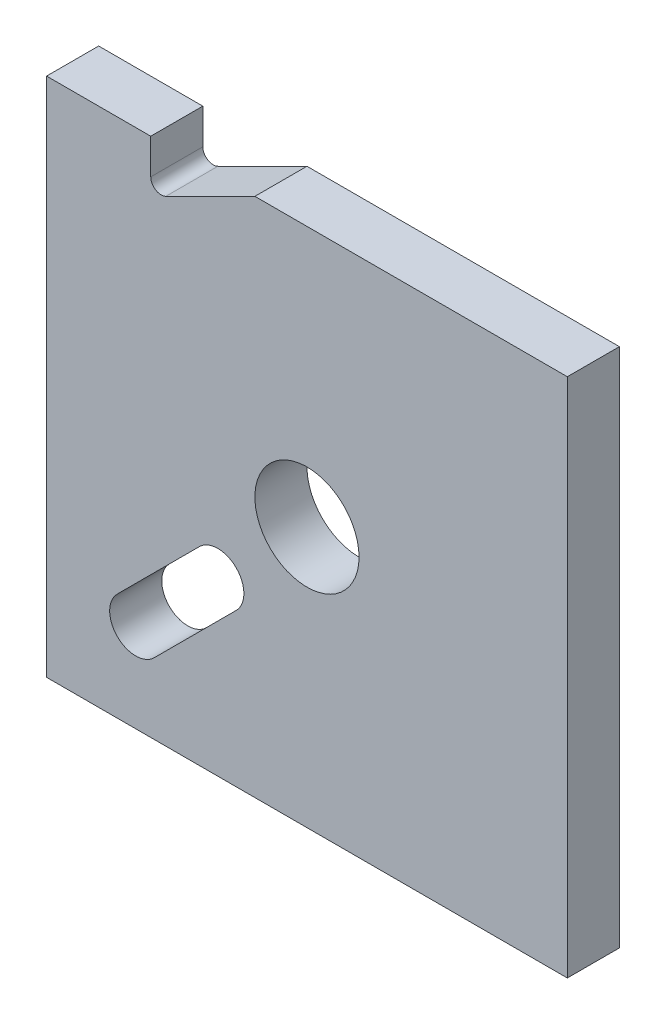
ISO-10303-21;
HEADER;
FILE_DESCRIPTION(('STEP AP214'),'2;1');
FILE_NAME('part.step','',(''),(''),'','','');
FILE_SCHEMA(('AUTOMOTIVE_DESIGN { 1 0 10303 214 1 1 1 1 }'));
ENDSEC;
DATA;
#1=APPLICATION_CONTEXT('core data for automotive mechanical design processes');
#2=APPLICATION_PROTOCOL_DEFINITION('international standard','automotive_design',2000,#1);
#3=PRODUCT_CONTEXT('',#1,'mechanical');
#4=PRODUCT('Part','Part','',(#3));
#5=PRODUCT_RELATED_PRODUCT_CATEGORY('part','',(#4));
#6=PRODUCT_DEFINITION_FORMATION('','',#4);
#7=PRODUCT_DEFINITION_CONTEXT('part definition',#1,'design');
#8=PRODUCT_DEFINITION('design','',#6,#7);
#9=PRODUCT_DEFINITION_SHAPE('','',#8);
#10=(LENGTH_UNIT() NAMED_UNIT(*) SI_UNIT(.MILLI.,.METRE.));
#11=(NAMED_UNIT(*) PLANE_ANGLE_UNIT() SI_UNIT($,.RADIAN.));
#12=(NAMED_UNIT(*) SI_UNIT($,.STERADIAN.) SOLID_ANGLE_UNIT());
#13=UNCERTAINTY_MEASURE_WITH_UNIT(LENGTH_MEASURE(1.E-05),#10,'distance_accuracy_value','');
#14=(GEOMETRIC_REPRESENTATION_CONTEXT(3) GLOBAL_UNCERTAINTY_ASSIGNED_CONTEXT((#13)) GLOBAL_UNIT_ASSIGNED_CONTEXT((#10,
#11,#12)) REPRESENTATION_CONTEXT('',''));
#15=CARTESIAN_POINT('',(0.,0.,0.));
#16=DIRECTION('',(0.,0.,1.));
#17=DIRECTION('',(1.,0.,0.));
#18=AXIS2_PLACEMENT_3D('',#15,#16,#17);
#19=CARTESIAN_POINT('',(0.,0.,2.5));
#20=DIRECTION('',(0.,0.,1.));
#21=DIRECTION('',(1.,0.,0.));
#22=AXIS2_PLACEMENT_3D('',#19,#20,#21);
#23=PLANE('',#22);
#24=CARTESIAN_POINT('',(-8.55806902390052,-8.55806902390052,2.5));
#25=DIRECTION('',(0.,0.,1.));
#26=DIRECTION('',(1.,0.,0.));
#27=AXIS2_PLACEMENT_3D('',#24,#25,#26);
#28=CIRCLE('',#27,2.5);
#29=CARTESIAN_POINT('',(-6.79030207093415,-10.3258359768669,2.5));
#30=VERTEX_POINT('',#29);
#31=CARTESIAN_POINT('',(-10.3258359768669,-6.79030207093415,2.5));
#32=VERTEX_POINT('',#31);
#33=EDGE_CURVE('E57',#30,#32,#28,.T.);
#34=ORIENTED_EDGE('',*,*,#33,.F.);
#35=DIRECTION('',(0.707106781186547,0.707106781186548,0.));
#36=VECTOR('',#35,1.);
#37=CARTESIAN_POINT('',(-6.79030207093415,-10.3258359768669,2.5));
#38=LINE('',#37,#36);
#39=CARTESIAN_POINT('',(-14.6741640231331,-18.2096979290659,2.5));
#40=VERTEX_POINT('',#39);
#41=EDGE_CURVE('E175',#40,#30,#38,.T.);
#42=ORIENTED_EDGE('',*,*,#41,.F.);
#43=CARTESIAN_POINT('',(-16.4419309760995,-16.4419309760995,2.5));
#44=DIRECTION('',(0.,0.,1.));
#45=DIRECTION('',(1.,0.,0.));
#46=AXIS2_PLACEMENT_3D('',#43,#44,#45);
#47=CIRCLE('',#46,2.5);
#48=CARTESIAN_POINT('',(-18.2096979290659,-14.6741640231331,2.5));
#49=VERTEX_POINT('',#48);
#50=EDGE_CURVE('E183',#49,#40,#47,.T.);
#51=ORIENTED_EDGE('',*,*,#50,.F.);
#52=DIRECTION('',(-0.707106781186547,-0.707106781186548,0.));
#53=VECTOR('',#52,1.);
#54=CARTESIAN_POINT('',(-10.3258359768669,-6.79030207093415,2.5));
#55=LINE('',#54,#53);
#56=EDGE_CURVE('E190',#32,#49,#55,.T.);
#57=ORIENTED_EDGE('',*,*,#56,.F.);
#58=EDGE_LOOP('',(#34,#42,#51,#57));
#59=FACE_BOUND('',#58,.T.);
#60=CARTESIAN_POINT('',(0.,0.,2.5));
#61=DIRECTION('',(0.,0.,1.));
#62=DIRECTION('',(1.,0.,0.));
#63=AXIS2_PLACEMENT_3D('',#60,#61,#62);
#64=CIRCLE('',#63,5.);
#65=CARTESIAN_POINT('',(4.99999999999999,0.,2.5));
#66=VERTEX_POINT('',#65);
#67=EDGE_CURVE('E218',#66,#66,#64,.T.);
#68=ORIENTED_EDGE('',*,*,#67,.F.);
#69=EDGE_LOOP('',(#68));
#70=FACE_BOUND('',#69,.T.);
#71=DIRECTION('',(-0.894427190999916,-0.447213595499958,0.));
#72=VECTOR('',#71,1.);
#73=CARTESIAN_POINT('',(-11.,22.,2.5));
#74=LINE('',#73,#72);
#75=CARTESIAN_POINT('',(-5.,25.,2.5));
#76=VERTEX_POINT('',#75);
#77=CARTESIAN_POINT('',(-13.5527864045,20.72360679775,2.5));
#78=VERTEX_POINT('',#77);
#79=EDGE_CURVE('E133',#76,#78,#74,.T.);
#80=ORIENTED_EDGE('',*,*,#79,.T.);
#81=CARTESIAN_POINT('',(-14.,21.6180339887499,2.5));
#82=DIRECTION('',(0.,0.,1.));
#83=DIRECTION('',(1.,0.,0.));
#84=AXIS2_PLACEMENT_3D('',#81,#82,#83);
#85=CIRCLE('',#84,1.);
#86=CARTESIAN_POINT('',(-15.,21.6180339887499,2.5));
#87=VERTEX_POINT('',#86);
#88=EDGE_CURVE('E142',#78,#87,#85,.F.);
#89=ORIENTED_EDGE('',*,*,#88,.T.);
#90=DIRECTION('',(0.,1.,0.));
#91=VECTOR('',#90,1.);
#92=CARTESIAN_POINT('',(-15.,0.,2.5));
#93=LINE('',#92,#91);
#94=CARTESIAN_POINT('',(-15.,25.,2.5));
#95=VERTEX_POINT('',#94);
#96=EDGE_CURVE('E147',#87,#95,#93,.T.);
#97=ORIENTED_EDGE('',*,*,#96,.T.);
#98=DIRECTION('',(-1.,0.,0.));
#99=VECTOR('',#98,1.);
#100=CARTESIAN_POINT('',(-25.,25.,2.5));
#101=LINE('',#100,#99);
#102=CARTESIAN_POINT('',(-25.,25.,2.5));
#103=VERTEX_POINT('',#102);
#104=EDGE_CURVE('E229',#95,#103,#101,.T.);
#105=ORIENTED_EDGE('',*,*,#104,.T.);
#106=DIRECTION('',(0.,-1.,0.));
#107=VECTOR('',#106,1.);
#108=CARTESIAN_POINT('',(-25.,25.,2.5));
#109=LINE('',#108,#107);
#110=CARTESIAN_POINT('',(-25.,-25.,2.5));
#111=VERTEX_POINT('',#110);
#112=EDGE_CURVE('E233',#103,#111,#109,.T.);
#113=ORIENTED_EDGE('',*,*,#112,.T.);
#114=DIRECTION('',(1.,0.,0.));
#115=VECTOR('',#114,1.);
#116=CARTESIAN_POINT('',(-25.,-25.,2.5));
#117=LINE('',#116,#115);
#118=CARTESIAN_POINT('',(25.,-25.,2.5));
#119=VERTEX_POINT('',#118);
#120=EDGE_CURVE('E258',#111,#119,#117,.T.);
#121=ORIENTED_EDGE('',*,*,#120,.T.);
#122=DIRECTION('',(0.,1.,0.));
#123=VECTOR('',#122,1.);
#124=CARTESIAN_POINT('',(25.,25.,2.5));
#125=LINE('',#124,#123);
#126=CARTESIAN_POINT('',(25.,25.,2.5));
#127=VERTEX_POINT('',#126);
#128=EDGE_CURVE('E226',#119,#127,#125,.T.);
#129=ORIENTED_EDGE('',*,*,#128,.T.);
#130=EDGE_CURVE('E145',#127,#76,#101,.T.);
#131=ORIENTED_EDGE('',*,*,#130,.T.);
#132=EDGE_LOOP('',(#80,#89,#97,#105,#113,#121,#129,#131));
#133=FACE_BOUND('',#132,.T.);
#134=ADVANCED_FACE('F39',(#59,#70,#133),#23,.T.);
#135=CARTESIAN_POINT('',(0.,0.,-2.5));
#136=DIRECTION('',(0.,0.,1.));
#137=DIRECTION('',(1.,0.,0.));
#138=AXIS2_PLACEMENT_3D('',#135,#136,#137);
#139=PLANE('',#138);
#140=DIRECTION('',(0.707106781186547,0.707106781186548,0.));
#141=VECTOR('',#140,1.);
#142=CARTESIAN_POINT('',(-14.6741640231331,-18.2096979290659,-2.5));
#143=LINE('',#142,#141);
#144=CARTESIAN_POINT('',(-14.6741640231331,-18.2096979290659,-2.5));
#145=VERTEX_POINT('',#144);
#146=CARTESIAN_POINT('',(-6.79030207093415,-10.3258359768669,-2.5));
#147=VERTEX_POINT('',#146);
#148=EDGE_CURVE('E49',#145,#147,#143,.T.);
#149=ORIENTED_EDGE('',*,*,#148,.T.);
#150=CARTESIAN_POINT('',(-8.55806902390052,-8.55806902390052,-2.5));
#151=DIRECTION('',(0.,0.,1.));
#152=DIRECTION('',(1.,0.,0.));
#153=AXIS2_PLACEMENT_3D('',#150,#151,#152);
#154=CIRCLE('',#153,2.5);
#155=CARTESIAN_POINT('',(-10.3258359768669,-6.79030207093415,-2.5));
#156=VERTEX_POINT('',#155);
#157=EDGE_CURVE('E11',#147,#156,#154,.T.);
#158=ORIENTED_EDGE('',*,*,#157,.T.);
#159=DIRECTION('',(-0.707106781186547,-0.707106781186548,0.));
#160=VECTOR('',#159,1.);
#161=CARTESIAN_POINT('',(-10.3258359768669,-6.79030207093415,-2.5));
#162=LINE('',#161,#160);
#163=CARTESIAN_POINT('',(-18.2096979290659,-14.6741640231331,-2.5));
#164=VERTEX_POINT('',#163);
#165=EDGE_CURVE('E153',#156,#164,#162,.T.);
#166=ORIENTED_EDGE('',*,*,#165,.T.);
#167=CARTESIAN_POINT('',(-16.4419309760995,-16.4419309760995,-2.5));
#168=DIRECTION('',(0.,0.,1.));
#169=DIRECTION('',(1.,0.,0.));
#170=AXIS2_PLACEMENT_3D('',#167,#168,#169);
#171=CIRCLE('',#170,2.5);
#172=EDGE_CURVE('E158',#164,#145,#171,.T.);
#173=ORIENTED_EDGE('',*,*,#172,.T.);
#174=EDGE_LOOP('',(#149,#158,#166,#173));
#175=FACE_BOUND('',#174,.T.);
#176=CARTESIAN_POINT('',(0.,0.,-2.5));
#177=DIRECTION('',(0.,0.,1.));
#178=DIRECTION('',(1.,0.,0.));
#179=AXIS2_PLACEMENT_3D('',#176,#177,#178);
#180=CIRCLE('',#179,5.);
#181=CARTESIAN_POINT('',(4.99999999999999,0.,-2.5));
#182=VERTEX_POINT('',#181);
#183=EDGE_CURVE('E217',#182,#182,#180,.T.);
#184=ORIENTED_EDGE('',*,*,#183,.T.);
#185=EDGE_LOOP('',(#184));
#186=FACE_BOUND('',#185,.T.);
#187=DIRECTION('',(0.,-1.,0.));
#188=VECTOR('',#187,1.);
#189=CARTESIAN_POINT('',(-15.,0.,-2.5));
#190=LINE('',#189,#188);
#191=CARTESIAN_POINT('',(-15.,25.,-2.5));
#192=VERTEX_POINT('',#191);
#193=CARTESIAN_POINT('',(-15.,21.6180339887499,-2.5));
#194=VERTEX_POINT('',#193);
#195=EDGE_CURVE('E204',#192,#194,#190,.T.);
#196=ORIENTED_EDGE('',*,*,#195,.T.);
#197=CARTESIAN_POINT('',(-14.,21.6180339887499,-2.5));
#198=DIRECTION('',(0.,0.,1.));
#199=DIRECTION('',(1.,0.,0.));
#200=AXIS2_PLACEMENT_3D('',#197,#198,#199);
#201=CIRCLE('',#200,1.);
#202=CARTESIAN_POINT('',(-13.5527864045,20.72360679775,-2.5));
#203=VERTEX_POINT('',#202);
#204=EDGE_CURVE('E126',#194,#203,#201,.T.);
#205=ORIENTED_EDGE('',*,*,#204,.T.);
#206=DIRECTION('',(0.894427190999916,0.447213595499958,0.));
#207=VECTOR('',#206,1.);
#208=CARTESIAN_POINT('',(-11.,22.,-2.5));
#209=LINE('',#208,#207);
#210=CARTESIAN_POINT('',(-5.,25.,-2.5));
#211=VERTEX_POINT('',#210);
#212=EDGE_CURVE('E82',#203,#211,#209,.T.);
#213=ORIENTED_EDGE('',*,*,#212,.T.);
#214=DIRECTION('',(-1.,0.,0.));
#215=VECTOR('',#214,1.);
#216=CARTESIAN_POINT('',(-25.,25.,-2.5));
#217=LINE('',#216,#215);
#218=CARTESIAN_POINT('',(25.,25.,-2.5));
#219=VERTEX_POINT('',#218);
#220=EDGE_CURVE('E264',#219,#211,#217,.T.);
#221=ORIENTED_EDGE('',*,*,#220,.F.);
#222=DIRECTION('',(0.,1.,0.));
#223=VECTOR('',#222,1.);
#224=CARTESIAN_POINT('',(25.,25.,-2.5));
#225=LINE('',#224,#223);
#226=CARTESIAN_POINT('',(25.,-25.,-2.5));
#227=VERTEX_POINT('',#226);
#228=EDGE_CURVE('E222',#227,#219,#225,.T.);
#229=ORIENTED_EDGE('',*,*,#228,.F.);
#230=DIRECTION('',(1.,0.,0.));
#231=VECTOR('',#230,1.);
#232=CARTESIAN_POINT('',(-25.,-25.,-2.5));
#233=LINE('',#232,#231);
#234=CARTESIAN_POINT('',(-25.,-25.,-2.5));
#235=VERTEX_POINT('',#234);
#236=EDGE_CURVE('E230',#235,#227,#233,.T.);
#237=ORIENTED_EDGE('',*,*,#236,.F.);
#238=DIRECTION('',(0.,-1.,0.));
#239=VECTOR('',#238,1.);
#240=CARTESIAN_POINT('',(-25.,25.,-2.5));
#241=LINE('',#240,#239);
#242=CARTESIAN_POINT('',(-25.,25.,-2.5));
#243=VERTEX_POINT('',#242);
#244=EDGE_CURVE('E261',#243,#235,#241,.T.);
#245=ORIENTED_EDGE('',*,*,#244,.F.);
#246=EDGE_CURVE('E268',#192,#243,#217,.T.);
#247=ORIENTED_EDGE('',*,*,#246,.F.);
#248=EDGE_LOOP('',(#196,#205,#213,#221,#229,#237,#245,#247));
#249=FACE_BOUND('',#248,.T.);
#250=ADVANCED_FACE('F167',(#175,#186,#249),#139,.F.);
#251=CARTESIAN_POINT('',(-25.,25.,2.5));
#252=DIRECTION('',(0.,-1.,0.));
#253=DIRECTION('',(0.,0.,-1.));
#254=AXIS2_PLACEMENT_3D('',#251,#252,#253);
#255=PLANE('',#254);
#256=DIRECTION('',(0.,0.,1.));
#257=VECTOR('',#256,1.);
#258=CARTESIAN_POINT('',(-15.,25.,2.5));
#259=LINE('',#258,#257);
#260=EDGE_CURVE('E245',#192,#95,#259,.T.);
#261=ORIENTED_EDGE('',*,*,#260,.F.);
#262=ORIENTED_EDGE('',*,*,#246,.T.);
#263=DIRECTION('',(0.,0.,-1.));
#264=VECTOR('',#263,1.);
#265=CARTESIAN_POINT('',(-25.,25.,2.5));
#266=LINE('',#265,#264);
#267=EDGE_CURVE('E246',#103,#243,#266,.T.);
#268=ORIENTED_EDGE('',*,*,#267,.F.);
#269=ORIENTED_EDGE('',*,*,#104,.F.);
#270=EDGE_LOOP('',(#261,#262,#268,#269));
#271=FACE_BOUND('',#270,.T.);
#272=ADVANCED_FACE('F297',(#271),#255,.F.);
#273=DIRECTION('',(0.,0.,1.));
#274=VECTOR('',#273,1.);
#275=CARTESIAN_POINT('',(-5.,25.,-2.5));
#276=LINE('',#275,#274);
#277=EDGE_CURVE('E148',#211,#76,#276,.T.);
#278=ORIENTED_EDGE('',*,*,#277,.T.);
#279=ORIENTED_EDGE('',*,*,#130,.F.);
#280=DIRECTION('',(0.,0.,-1.));
#281=VECTOR('',#280,1.);
#282=CARTESIAN_POINT('',(25.,25.,2.5));
#283=LINE('',#282,#281);
#284=EDGE_CURVE('E241',#127,#219,#283,.T.);
#285=ORIENTED_EDGE('',*,*,#284,.T.);
#286=ORIENTED_EDGE('',*,*,#220,.T.);
#287=EDGE_LOOP('',(#278,#279,#285,#286));
#288=FACE_BOUND('',#287,.T.);
#289=ADVANCED_FACE('F291',(#288),#255,.F.);
#290=CARTESIAN_POINT('',(25.,25.,2.5));
#291=DIRECTION('',(-1.,0.,0.));
#292=DIRECTION('',(0.,-1.,0.));
#293=AXIS2_PLACEMENT_3D('',#290,#291,#292);
#294=PLANE('',#293);
#295=ORIENTED_EDGE('',*,*,#228,.T.);
#296=ORIENTED_EDGE('',*,*,#284,.F.);
#297=ORIENTED_EDGE('',*,*,#128,.F.);
#298=DIRECTION('',(0.,0.,-1.));
#299=VECTOR('',#298,1.);
#300=CARTESIAN_POINT('',(25.,-25.,2.5));
#301=LINE('',#300,#299);
#302=EDGE_CURVE('E254',#119,#227,#301,.T.);
#303=ORIENTED_EDGE('',*,*,#302,.T.);
#304=EDGE_LOOP('',(#295,#296,#297,#303));
#305=FACE_BOUND('',#304,.T.);
#306=ADVANCED_FACE('F289',(#305),#294,.F.);
#307=CARTESIAN_POINT('',(-25.,25.,2.5));
#308=DIRECTION('',(1.,0.,0.));
#309=DIRECTION('',(0.,1.,0.));
#310=AXIS2_PLACEMENT_3D('',#307,#308,#309);
#311=PLANE('',#310);
#312=ORIENTED_EDGE('',*,*,#244,.T.);
#313=DIRECTION('',(0.,0.,-1.));
#314=VECTOR('',#313,1.);
#315=CARTESIAN_POINT('',(-25.,-25.,2.5));
#316=LINE('',#315,#314);
#317=EDGE_CURVE('E250',#111,#235,#316,.T.);
#318=ORIENTED_EDGE('',*,*,#317,.F.);
#319=ORIENTED_EDGE('',*,*,#112,.F.);
#320=ORIENTED_EDGE('',*,*,#267,.T.);
#321=EDGE_LOOP('',(#312,#318,#319,#320));
#322=FACE_BOUND('',#321,.T.);
#323=ADVANCED_FACE('F280',(#322),#311,.F.);
#324=CARTESIAN_POINT('',(-25.,-25.,2.5));
#325=DIRECTION('',(0.,1.,0.));
#326=DIRECTION('',(0.,0.,1.));
#327=AXIS2_PLACEMENT_3D('',#324,#325,#326);
#328=PLANE('',#327);
#329=ORIENTED_EDGE('',*,*,#236,.T.);
#330=ORIENTED_EDGE('',*,*,#302,.F.);
#331=ORIENTED_EDGE('',*,*,#120,.F.);
#332=ORIENTED_EDGE('',*,*,#317,.T.);
#333=EDGE_LOOP('',(#329,#330,#331,#332));
#334=FACE_BOUND('',#333,.T.);
#335=ADVANCED_FACE('F284',(#334),#328,.F.);
#336=CARTESIAN_POINT('',(0.,0.,2.5));
#337=DIRECTION('',(0.,0.,-1.));
#338=DIRECTION('',(-1.,0.,0.));
#339=AXIS2_PLACEMENT_3D('',#336,#337,#338);
#340=CYLINDRICAL_SURFACE('',#339,5.);
#341=ORIENTED_EDGE('',*,*,#67,.T.);
#342=EDGE_LOOP('',(#341));
#343=FACE_BOUND('',#342,.T.);
#344=ORIENTED_EDGE('',*,*,#183,.F.);
#345=EDGE_LOOP('',(#344));
#346=FACE_BOUND('',#345,.T.);
#347=ADVANCED_FACE('F305',(#343,#346),#340,.F.);
#348=CARTESIAN_POINT('',(-15.,0.,2.500012));
#349=DIRECTION('',(1.,0.,0.));
#350=DIRECTION('',(0.,0.,-1.));
#351=AXIS2_PLACEMENT_3D('',#348,#349,#350);
#352=PLANE('',#351);
#353=ORIENTED_EDGE('',*,*,#96,.F.);
#354=DIRECTION('',(0.,0.,-1.));
#355=VECTOR('',#354,1.);
#356=CARTESIAN_POINT('',(-15.,21.6180339887499,-2.5));
#357=LINE('',#356,#355);
#358=EDGE_CURVE('E138',#87,#194,#357,.T.);
#359=ORIENTED_EDGE('',*,*,#358,.T.);
#360=ORIENTED_EDGE('',*,*,#195,.F.);
#361=ORIENTED_EDGE('',*,*,#260,.T.);
#362=EDGE_LOOP('',(#353,#359,#360,#361));
#363=FACE_BOUND('',#362,.T.);
#364=ADVANCED_FACE('F303',(#363),#352,.T.);
#365=CARTESIAN_POINT('',(-11.,22.,2.500012));
#366=DIRECTION('',(-0.447213595499958,0.894427190999916,0.));
#367=DIRECTION('',(-0.894427190999916,-0.447213595499958,0.));
#368=AXIS2_PLACEMENT_3D('',#365,#366,#367);
#369=PLANE('',#368);
#370=ORIENTED_EDGE('',*,*,#212,.F.);
#371=DIRECTION('',(0.,0.,-1.));
#372=VECTOR('',#371,1.);
#373=CARTESIAN_POINT('',(-13.5527864045,20.72360679775,2.5));
#374=LINE('',#373,#372);
#375=EDGE_CURVE('E130',#203,#78,#374,.F.);
#376=ORIENTED_EDGE('',*,*,#375,.T.);
#377=ORIENTED_EDGE('',*,*,#79,.F.);
#378=ORIENTED_EDGE('',*,*,#277,.F.);
#379=EDGE_LOOP('',(#370,#376,#377,#378));
#380=FACE_BOUND('',#379,.T.);
#381=ADVANCED_FACE('F132',(#380),#369,.T.);
#382=CARTESIAN_POINT('',(-14.,21.6180339887499,2.500012));
#383=DIRECTION('',(0.,0.,1.));
#384=DIRECTION('',(1.,0.,0.));
#385=AXIS2_PLACEMENT_3D('',#382,#383,#384);
#386=CYLINDRICAL_SURFACE('',#385,1.);
#387=ORIENTED_EDGE('',*,*,#88,.F.);
#388=ORIENTED_EDGE('',*,*,#375,.F.);
#389=ORIENTED_EDGE('',*,*,#204,.F.);
#390=ORIENTED_EDGE('',*,*,#358,.F.);
#391=EDGE_LOOP('',(#387,#388,#389,#390));
#392=FACE_BOUND('',#391,.T.);
#393=ADVANCED_FACE('F41',(#392),#386,.F.);
#394=CARTESIAN_POINT('',(-8.55806902390052,-8.55806902390052,-2.500025));
#395=DIRECTION('',(0.,0.,1.));
#396=DIRECTION('',(1.,0.,0.));
#397=AXIS2_PLACEMENT_3D('',#394,#395,#396);
#398=CYLINDRICAL_SURFACE('',#397,2.5);
#399=DIRECTION('',(0.,0.,1.));
#400=VECTOR('',#399,1.);
#401=CARTESIAN_POINT('',(-6.79030207093415,-10.3258359768669,-2.500025));
#402=LINE('',#401,#400);
#403=EDGE_CURVE('E73',#147,#30,#402,.T.);
#404=ORIENTED_EDGE('',*,*,#403,.T.);
#405=ORIENTED_EDGE('',*,*,#33,.T.);
#406=DIRECTION('',(0.,0.,1.));
#407=VECTOR('',#406,1.);
#408=CARTESIAN_POINT('',(-10.3258359768669,-6.79030207093415,-2.500025));
#409=LINE('',#408,#407);
#410=EDGE_CURVE('E194',#156,#32,#409,.T.);
#411=ORIENTED_EDGE('',*,*,#410,.F.);
#412=ORIENTED_EDGE('',*,*,#157,.F.);
#413=EDGE_LOOP('',(#404,#405,#411,#412));
#414=FACE_BOUND('',#413,.T.);
#415=ADVANCED_FACE('F349',(#414),#398,.F.);
#416=CARTESIAN_POINT('',(-6.79030207093415,-10.3258359768669,-2.500025));
#417=DIRECTION('',(0.707106781186548,-0.707106781186547,0.));
#418=DIRECTION('',(0.707106781186547,0.707106781186548,0.));
#419=AXIS2_PLACEMENT_3D('',#416,#417,#418);
#420=PLANE('',#419);
#421=DIRECTION('',(0.,0.,1.));
#422=VECTOR('',#421,1.);
#423=CARTESIAN_POINT('',(-14.6741640231331,-18.2096979290659,-2.500025));
#424=LINE('',#423,#422);
#425=EDGE_CURVE('E172',#145,#40,#424,.T.);
#426=ORIENTED_EDGE('',*,*,#425,.T.);
#427=ORIENTED_EDGE('',*,*,#41,.T.);
#428=ORIENTED_EDGE('',*,*,#403,.F.);
#429=ORIENTED_EDGE('',*,*,#148,.F.);
#430=EDGE_LOOP('',(#426,#427,#428,#429));
#431=FACE_BOUND('',#430,.T.);
#432=ADVANCED_FACE('F170',(#431),#420,.F.);
#433=CARTESIAN_POINT('',(-16.4419309760995,-16.4419309760995,-2.500025));
#434=DIRECTION('',(0.,0.,1.));
#435=DIRECTION('',(1.,0.,0.));
#436=AXIS2_PLACEMENT_3D('',#433,#434,#435);
#437=CYLINDRICAL_SURFACE('',#436,2.5);
#438=DIRECTION('',(0.,0.,1.));
#439=VECTOR('',#438,1.);
#440=CARTESIAN_POINT('',(-18.2096979290659,-14.6741640231331,-2.500025));
#441=LINE('',#440,#439);
#442=EDGE_CURVE('E179',#164,#49,#441,.T.);
#443=ORIENTED_EDGE('',*,*,#442,.T.);
#444=ORIENTED_EDGE('',*,*,#50,.T.);
#445=ORIENTED_EDGE('',*,*,#425,.F.);
#446=ORIENTED_EDGE('',*,*,#172,.F.);
#447=EDGE_LOOP('',(#443,#444,#445,#446));
#448=FACE_BOUND('',#447,.T.);
#449=ADVANCED_FACE('F184',(#448),#437,.F.);
#450=CARTESIAN_POINT('',(-10.3258359768669,-6.79030207093415,-2.500025));
#451=DIRECTION('',(-0.707106781186548,0.707106781186547,0.));
#452=DIRECTION('',(-0.707106781186547,-0.707106781186548,0.));
#453=AXIS2_PLACEMENT_3D('',#450,#451,#452);
#454=PLANE('',#453);
#455=ORIENTED_EDGE('',*,*,#410,.T.);
#456=ORIENTED_EDGE('',*,*,#56,.T.);
#457=ORIENTED_EDGE('',*,*,#442,.F.);
#458=ORIENTED_EDGE('',*,*,#165,.F.);
#459=EDGE_LOOP('',(#455,#456,#457,#458));
#460=FACE_BOUND('',#459,.T.);
#461=ADVANCED_FACE('F372',(#460),#454,.F.);
#462=CLOSED_SHELL('',(#134,#250,#272,#289,#306,#323,#335,#347,#364,#381,#393,#415,#432,#449,#461));
#463=MANIFOLD_SOLID_BREP('B2',#462);
#464=ADVANCED_BREP_SHAPE_REPRESENTATION('',(#18,#463),#14);
#465=SHAPE_DEFINITION_REPRESENTATION(#9,#464);
ENDSEC;
END-ISO-10303-21;
